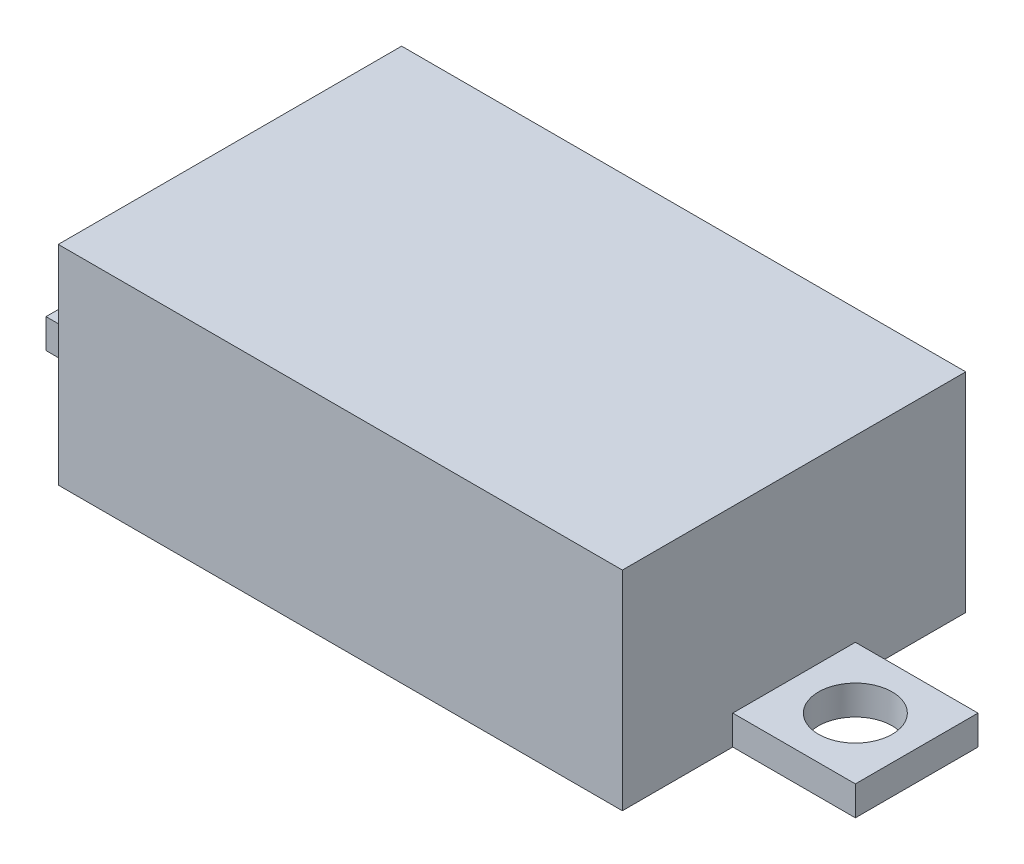
ISO-10303-21;
HEADER;
FILE_DESCRIPTION(('STEP AP214'),'2;1');
FILE_NAME('part.step','',(''),(''),'','','');
FILE_SCHEMA(('AUTOMOTIVE_DESIGN { 1 0 10303 214 1 1 1 1 }'));
ENDSEC;
DATA;
#1=APPLICATION_CONTEXT('core data for automotive mechanical design processes');
#2=APPLICATION_PROTOCOL_DEFINITION('international standard','automotive_design',2000,#1);
#3=PRODUCT_CONTEXT('',#1,'mechanical');
#4=PRODUCT('Part','Part','',(#3));
#5=PRODUCT_RELATED_PRODUCT_CATEGORY('part','',(#4));
#6=PRODUCT_DEFINITION_FORMATION('','',#4);
#7=PRODUCT_DEFINITION_CONTEXT('part definition',#1,'design');
#8=PRODUCT_DEFINITION('design','',#6,#7);
#9=PRODUCT_DEFINITION_SHAPE('','',#8);
#10=(LENGTH_UNIT() NAMED_UNIT(*) SI_UNIT(.MILLI.,.METRE.));
#11=(NAMED_UNIT(*) PLANE_ANGLE_UNIT() SI_UNIT($,.RADIAN.));
#12=(NAMED_UNIT(*) SI_UNIT($,.STERADIAN.) SOLID_ANGLE_UNIT());
#13=UNCERTAINTY_MEASURE_WITH_UNIT(LENGTH_MEASURE(1.E-05),#10,'distance_accuracy_value','');
#14=(GEOMETRIC_REPRESENTATION_CONTEXT(3) GLOBAL_UNCERTAINTY_ASSIGNED_CONTEXT((#13)) GLOBAL_UNIT_ASSIGNED_CONTEXT((#10,
#11,#12)) REPRESENTATION_CONTEXT('',''));
#15=CARTESIAN_POINT('',(0.,0.,0.));
#16=DIRECTION('',(0.,0.,1.));
#17=DIRECTION('',(1.,0.,0.));
#18=AXIS2_PLACEMENT_3D('',#15,#16,#17);
#19=CARTESIAN_POINT('',(0.,8.5,0.));
#20=DIRECTION('',(1.,0.,0.));
#21=DIRECTION('',(0.,0.,-1.));
#22=AXIS2_PLACEMENT_3D('',#19,#20,#21);
#23=PLANE('',#22);
#24=DIRECTION('',(0.,0.,-1.));
#25=VECTOR('',#24,1.);
#26=CARTESIAN_POINT('',(0.,1.2,0.));
#27=LINE('',#26,#25);
#28=CARTESIAN_POINT('',(0.,1.2,-4.5));
#29=VERTEX_POINT('',#28);
#30=CARTESIAN_POINT('',(0.,1.2,-9.5));
#31=VERTEX_POINT('',#30);
#32=EDGE_CURVE('E51',#29,#31,#27,.T.);
#33=ORIENTED_EDGE('',*,*,#32,.F.);
#34=DIRECTION('',(0.,-1.,0.));
#35=VECTOR('',#34,1.);
#36=CARTESIAN_POINT('',(0.,8.5,-4.5));
#37=LINE('',#36,#35);
#38=CARTESIAN_POINT('',(0.,0.,-4.5));
#39=VERTEX_POINT('',#38);
#40=EDGE_CURVE('E177',#29,#39,#37,.T.);
#41=ORIENTED_EDGE('',*,*,#40,.T.);
#42=DIRECTION('',(0.,0.,1.));
#43=VECTOR('',#42,1.);
#44=CARTESIAN_POINT('',(0.,0.,0.));
#45=LINE('',#44,#43);
#46=CARTESIAN_POINT('',(0.,0.,0.));
#47=VERTEX_POINT('',#46);
#48=EDGE_CURVE('E180',#39,#47,#45,.T.);
#49=ORIENTED_EDGE('',*,*,#48,.T.);
#50=DIRECTION('',(0.,-1.,0.));
#51=VECTOR('',#50,1.);
#52=CARTESIAN_POINT('',(0.,8.5,0.));
#53=LINE('',#52,#51);
#54=CARTESIAN_POINT('',(0.,8.5,0.));
#55=VERTEX_POINT('',#54);
#56=EDGE_CURVE('E40',#55,#47,#53,.T.);
#57=ORIENTED_EDGE('',*,*,#56,.F.);
#58=DIRECTION('',(0.,0.,1.));
#59=VECTOR('',#58,1.);
#60=CARTESIAN_POINT('',(0.,8.5,0.));
#61=LINE('',#60,#59);
#62=CARTESIAN_POINT('',(0.,8.5,-14.));
#63=VERTEX_POINT('',#62);
#64=EDGE_CURVE('E181',#63,#55,#61,.T.);
#65=ORIENTED_EDGE('',*,*,#64,.F.);
#66=DIRECTION('',(0.,-1.,0.));
#67=VECTOR('',#66,1.);
#68=CARTESIAN_POINT('',(0.,8.5,-14.));
#69=LINE('',#68,#67);
#70=CARTESIAN_POINT('',(0.,0.,-14.));
#71=VERTEX_POINT('',#70);
#72=EDGE_CURVE('E191',#63,#71,#69,.T.);
#73=ORIENTED_EDGE('',*,*,#72,.T.);
#74=CARTESIAN_POINT('',(0.,0.,-9.5));
#75=VERTEX_POINT('',#74);
#76=EDGE_CURVE('E192',#71,#75,#45,.T.);
#77=ORIENTED_EDGE('',*,*,#76,.T.);
#78=DIRECTION('',(0.,1.,0.));
#79=VECTOR('',#78,1.);
#80=CARTESIAN_POINT('',(0.,8.5,-9.5));
#81=LINE('',#80,#79);
#82=EDGE_CURVE('E47',#75,#31,#81,.T.);
#83=ORIENTED_EDGE('',*,*,#82,.T.);
#84=EDGE_LOOP('',(#33,#41,#49,#57,#65,#73,#77,#83));
#85=FACE_BOUND('',#84,.T.);
#86=ADVANCED_FACE('F33',(#85),#23,.F.);
#87=CARTESIAN_POINT('',(0.,8.5,0.));
#88=DIRECTION('',(0.,0.,-1.));
#89=DIRECTION('',(-1.,0.,0.));
#90=AXIS2_PLACEMENT_3D('',#87,#88,#89);
#91=PLANE('',#90);
#92=DIRECTION('',(1.,0.,0.));
#93=VECTOR('',#92,1.);
#94=CARTESIAN_POINT('',(0.,0.,0.));
#95=LINE('',#94,#93);
#96=CARTESIAN_POINT('',(23.,0.,0.));
#97=VERTEX_POINT('',#96);
#98=EDGE_CURVE('E194',#47,#97,#95,.T.);
#99=ORIENTED_EDGE('',*,*,#98,.T.);
#100=DIRECTION('',(0.,-1.,0.));
#101=VECTOR('',#100,1.);
#102=CARTESIAN_POINT('',(23.,8.5,0.));
#103=LINE('',#102,#101);
#104=CARTESIAN_POINT('',(23.,8.5,0.));
#105=VERTEX_POINT('',#104);
#106=EDGE_CURVE('E205',#105,#97,#103,.T.);
#107=ORIENTED_EDGE('',*,*,#106,.F.);
#108=DIRECTION('',(1.,0.,0.));
#109=VECTOR('',#108,1.);
#110=CARTESIAN_POINT('',(0.,8.5,0.));
#111=LINE('',#110,#109);
#112=EDGE_CURVE('E184',#55,#105,#111,.T.);
#113=ORIENTED_EDGE('',*,*,#112,.F.);
#114=ORIENTED_EDGE('',*,*,#56,.T.);
#115=EDGE_LOOP('',(#99,#107,#113,#114));
#116=FACE_BOUND('',#115,.T.);
#117=ADVANCED_FACE('F210',(#116),#91,.F.);
#118=CARTESIAN_POINT('',(23.,8.5,0.));
#119=DIRECTION('',(-1.,0.,0.));
#120=DIRECTION('',(0.,0.,1.));
#121=AXIS2_PLACEMENT_3D('',#118,#119,#120);
#122=PLANE('',#121);
#123=DIRECTION('',(0.,0.,-1.));
#124=VECTOR('',#123,1.);
#125=CARTESIAN_POINT('',(23.,0.,0.));
#126=LINE('',#125,#124);
#127=CARTESIAN_POINT('',(23.,0.,-4.5));
#128=VERTEX_POINT('',#127);
#129=EDGE_CURVE('E197',#97,#128,#126,.T.);
#130=ORIENTED_EDGE('',*,*,#129,.T.);
#131=DIRECTION('',(0.,1.,0.));
#132=VECTOR('',#131,1.);
#133=CARTESIAN_POINT('',(23.,8.5,-4.5));
#134=LINE('',#133,#132);
#135=CARTESIAN_POINT('',(23.,1.2,-4.5));
#136=VERTEX_POINT('',#135);
#137=EDGE_CURVE('E175',#128,#136,#134,.T.);
#138=ORIENTED_EDGE('',*,*,#137,.T.);
#139=DIRECTION('',(0.,0.,1.));
#140=VECTOR('',#139,1.);
#141=CARTESIAN_POINT('',(23.,1.2,0.));
#142=LINE('',#141,#140);
#143=CARTESIAN_POINT('',(23.,1.2,-9.5));
#144=VERTEX_POINT('',#143);
#145=EDGE_CURVE('E11',#144,#136,#142,.T.);
#146=ORIENTED_EDGE('',*,*,#145,.F.);
#147=DIRECTION('',(0.,-1.,0.));
#148=VECTOR('',#147,1.);
#149=CARTESIAN_POINT('',(23.,8.5,-9.5));
#150=LINE('',#149,#148);
#151=CARTESIAN_POINT('',(23.,0.,-9.5));
#152=VERTEX_POINT('',#151);
#153=EDGE_CURVE('E167',#144,#152,#150,.T.);
#154=ORIENTED_EDGE('',*,*,#153,.T.);
#155=CARTESIAN_POINT('',(23.,0.,-14.));
#156=VERTEX_POINT('',#155);
#157=EDGE_CURVE('E196',#152,#156,#126,.T.);
#158=ORIENTED_EDGE('',*,*,#157,.T.);
#159=DIRECTION('',(0.,-1.,0.));
#160=VECTOR('',#159,1.);
#161=CARTESIAN_POINT('',(23.,8.5,-14.));
#162=LINE('',#161,#160);
#163=CARTESIAN_POINT('',(23.,8.5,-14.));
#164=VERTEX_POINT('',#163);
#165=EDGE_CURVE('E202',#164,#156,#162,.T.);
#166=ORIENTED_EDGE('',*,*,#165,.F.);
#167=DIRECTION('',(0.,0.,-1.));
#168=VECTOR('',#167,1.);
#169=CARTESIAN_POINT('',(23.,8.5,0.));
#170=LINE('',#169,#168);
#171=EDGE_CURVE('E187',#105,#164,#170,.T.);
#172=ORIENTED_EDGE('',*,*,#171,.F.);
#173=ORIENTED_EDGE('',*,*,#106,.T.);
#174=EDGE_LOOP('',(#130,#138,#146,#154,#158,#166,#172,#173));
#175=FACE_BOUND('',#174,.T.);
#176=ADVANCED_FACE('F221',(#175),#122,.F.);
#177=CARTESIAN_POINT('',(0.,8.5,-14.));
#178=DIRECTION('',(0.,0.,1.));
#179=DIRECTION('',(1.,0.,0.));
#180=AXIS2_PLACEMENT_3D('',#177,#178,#179);
#181=PLANE('',#180);
#182=DIRECTION('',(-1.,0.,0.));
#183=VECTOR('',#182,1.);
#184=CARTESIAN_POINT('',(0.,0.,-14.));
#185=LINE('',#184,#183);
#186=EDGE_CURVE('E185',#156,#71,#185,.T.);
#187=ORIENTED_EDGE('',*,*,#186,.T.);
#188=ORIENTED_EDGE('',*,*,#72,.F.);
#189=DIRECTION('',(-1.,0.,0.));
#190=VECTOR('',#189,1.);
#191=CARTESIAN_POINT('',(0.,8.5,-14.));
#192=LINE('',#191,#190);
#193=EDGE_CURVE('E189',#164,#63,#192,.T.);
#194=ORIENTED_EDGE('',*,*,#193,.F.);
#195=ORIENTED_EDGE('',*,*,#165,.T.);
#196=EDGE_LOOP('',(#187,#188,#194,#195));
#197=FACE_BOUND('',#196,.T.);
#198=ADVANCED_FACE('F241',(#197),#181,.F.);
#199=CARTESIAN_POINT('',(0.,8.5,0.));
#200=DIRECTION('',(0.,-1.,0.));
#201=DIRECTION('',(0.,0.,-1.));
#202=AXIS2_PLACEMENT_3D('',#199,#200,#201);
#203=PLANE('',#202);
#204=ORIENTED_EDGE('',*,*,#64,.T.);
#205=ORIENTED_EDGE('',*,*,#112,.T.);
#206=ORIENTED_EDGE('',*,*,#171,.T.);
#207=ORIENTED_EDGE('',*,*,#193,.T.);
#208=EDGE_LOOP('',(#204,#205,#206,#207));
#209=FACE_BOUND('',#208,.T.);
#210=ADVANCED_FACE('F244',(#209),#203,.F.);
#211=CARTESIAN_POINT('',(0.,0.,0.));
#212=DIRECTION('',(0.,-1.,0.));
#213=DIRECTION('',(0.,0.,-1.));
#214=AXIS2_PLACEMENT_3D('',#211,#212,#213);
#215=PLANE('',#214);
#216=CARTESIAN_POINT('',(-2.5,0.,-7.));
#217=DIRECTION('',(0.,-1.,0.));
#218=DIRECTION('',(0.,0.,-1.));
#219=AXIS2_PLACEMENT_3D('',#216,#217,#218);
#220=CIRCLE('',#219,1.5);
#221=CARTESIAN_POINT('',(-2.5,0.,-8.5));
#222=VERTEX_POINT('',#221);
#223=EDGE_CURVE('E385',#222,#222,#220,.T.);
#224=ORIENTED_EDGE('',*,*,#223,.F.);
#225=EDGE_LOOP('',(#224));
#226=FACE_BOUND('',#225,.T.);
#227=CARTESIAN_POINT('',(25.5,0.,-7.));
#228=DIRECTION('',(0.,-1.,0.));
#229=DIRECTION('',(0.,0.,-1.));
#230=AXIS2_PLACEMENT_3D('',#227,#228,#229);
#231=CIRCLE('',#230,1.5);
#232=CARTESIAN_POINT('',(25.5,0.,-8.5));
#233=VERTEX_POINT('',#232);
#234=EDGE_CURVE('E151',#233,#233,#231,.T.);
#235=ORIENTED_EDGE('',*,*,#234,.F.);
#236=EDGE_LOOP('',(#235));
#237=FACE_BOUND('',#236,.T.);
#238=ORIENTED_EDGE('',*,*,#157,.F.);
#239=DIRECTION('',(1.,0.,0.));
#240=VECTOR('',#239,1.);
#241=CARTESIAN_POINT('',(-5.,0.,-9.5));
#242=LINE('',#241,#240);
#243=CARTESIAN_POINT('',(28.,0.,-9.5));
#244=VERTEX_POINT('',#243);
#245=EDGE_CURVE('E161',#152,#244,#242,.T.);
#246=ORIENTED_EDGE('',*,*,#245,.T.);
#247=DIRECTION('',(0.,0.,1.));
#248=VECTOR('',#247,1.);
#249=CARTESIAN_POINT('',(28.,0.,-4.5));
#250=LINE('',#249,#248);
#251=CARTESIAN_POINT('',(28.,0.,-4.5));
#252=VERTEX_POINT('',#251);
#253=EDGE_CURVE('E163',#244,#252,#250,.T.);
#254=ORIENTED_EDGE('',*,*,#253,.T.);
#255=DIRECTION('',(-1.,0.,0.));
#256=VECTOR('',#255,1.);
#257=CARTESIAN_POINT('',(-5.,0.,-4.5));
#258=LINE('',#257,#256);
#259=EDGE_CURVE('E145',#252,#128,#258,.T.);
#260=ORIENTED_EDGE('',*,*,#259,.T.);
#261=ORIENTED_EDGE('',*,*,#129,.F.);
#262=ORIENTED_EDGE('',*,*,#98,.F.);
#263=ORIENTED_EDGE('',*,*,#48,.F.);
#264=CARTESIAN_POINT('',(-5.,0.,-4.5));
#265=VERTEX_POINT('',#264);
#266=EDGE_CURVE('E148',#39,#265,#258,.T.);
#267=ORIENTED_EDGE('',*,*,#266,.T.);
#268=DIRECTION('',(0.,0.,-1.));
#269=VECTOR('',#268,1.);
#270=CARTESIAN_POINT('',(-5.,0.,-4.5));
#271=LINE('',#270,#269);
#272=CARTESIAN_POINT('',(-5.,0.,-9.5));
#273=VERTEX_POINT('',#272);
#274=EDGE_CURVE('E159',#265,#273,#271,.T.);
#275=ORIENTED_EDGE('',*,*,#274,.T.);
#276=EDGE_CURVE('E125',#273,#75,#242,.T.);
#277=ORIENTED_EDGE('',*,*,#276,.T.);
#278=ORIENTED_EDGE('',*,*,#76,.F.);
#279=ORIENTED_EDGE('',*,*,#186,.F.);
#280=EDGE_LOOP('',(#238,#246,#254,#260,#261,#262,#263,#267,#275,#277,#278,#279));
#281=FACE_BOUND('',#280,.T.);
#282=ADVANCED_FACE('F217',(#226,#237,#281),#215,.T.);
#283=CARTESIAN_POINT('',(28.,1.2,-4.5));
#284=DIRECTION('',(1.,0.,0.));
#285=DIRECTION('',(0.,0.,-1.));
#286=AXIS2_PLACEMENT_3D('',#283,#284,#285);
#287=PLANE('',#286);
#288=ORIENTED_EDGE('',*,*,#253,.F.);
#289=DIRECTION('',(0.,-1.,0.));
#290=VECTOR('',#289,1.);
#291=CARTESIAN_POINT('',(28.,1.2,-9.5));
#292=LINE('',#291,#290);
#293=CARTESIAN_POINT('',(28.,1.2,-9.5));
#294=VERTEX_POINT('',#293);
#295=EDGE_CURVE('E130',#294,#244,#292,.T.);
#296=ORIENTED_EDGE('',*,*,#295,.F.);
#297=DIRECTION('',(0.,0.,1.));
#298=VECTOR('',#297,1.);
#299=CARTESIAN_POINT('',(28.,1.2,-4.5));
#300=LINE('',#299,#298);
#301=CARTESIAN_POINT('',(28.,1.2,-4.5));
#302=VERTEX_POINT('',#301);
#303=EDGE_CURVE('E138',#294,#302,#300,.T.);
#304=ORIENTED_EDGE('',*,*,#303,.T.);
#305=DIRECTION('',(0.,-1.,0.));
#306=VECTOR('',#305,1.);
#307=CARTESIAN_POINT('',(28.,1.2,-4.5));
#308=LINE('',#307,#306);
#309=EDGE_CURVE('E168',#302,#252,#308,.T.);
#310=ORIENTED_EDGE('',*,*,#309,.T.);
#311=EDGE_LOOP('',(#288,#296,#304,#310));
#312=FACE_BOUND('',#311,.T.);
#313=ADVANCED_FACE('F252',(#312),#287,.T.);
#314=CARTESIAN_POINT('',(0.,1.2,0.));
#315=DIRECTION('',(0.,-1.,0.));
#316=DIRECTION('',(0.,0.,-1.));
#317=AXIS2_PLACEMENT_3D('',#314,#315,#316);
#318=PLANE('',#317);
#319=CARTESIAN_POINT('',(25.5,1.2,-7.));
#320=DIRECTION('',(0.,1.,0.));
#321=DIRECTION('',(0.,0.,1.));
#322=AXIS2_PLACEMENT_3D('',#319,#320,#321);
#323=CIRCLE('',#322,1.5);
#324=CARTESIAN_POINT('',(25.5,1.2,-5.5));
#325=VERTEX_POINT('',#324);
#326=EDGE_CURVE('E381',#325,#325,#323,.T.);
#327=ORIENTED_EDGE('',*,*,#326,.F.);
#328=EDGE_LOOP('',(#327));
#329=FACE_BOUND('',#328,.T.);
#330=DIRECTION('',(1.,0.,0.));
#331=VECTOR('',#330,1.);
#332=CARTESIAN_POINT('',(-5.,1.2,-9.5));
#333=LINE('',#332,#331);
#334=EDGE_CURVE('E139',#144,#294,#333,.T.);
#335=ORIENTED_EDGE('',*,*,#334,.F.);
#336=ORIENTED_EDGE('',*,*,#145,.T.);
#337=DIRECTION('',(-1.,0.,0.));
#338=VECTOR('',#337,1.);
#339=CARTESIAN_POINT('',(-5.,1.2,-4.5));
#340=LINE('',#339,#338);
#341=EDGE_CURVE('E131',#302,#136,#340,.T.);
#342=ORIENTED_EDGE('',*,*,#341,.F.);
#343=ORIENTED_EDGE('',*,*,#303,.F.);
#344=EDGE_LOOP('',(#335,#336,#342,#343));
#345=FACE_BOUND('',#344,.T.);
#346=ADVANCED_FACE('F229',(#329,#345),#318,.F.);
#347=CARTESIAN_POINT('',(-5.,1.2,-9.5));
#348=DIRECTION('',(0.,0.,-1.));
#349=DIRECTION('',(-1.,0.,0.));
#350=AXIS2_PLACEMENT_3D('',#347,#348,#349);
#351=PLANE('',#350);
#352=ORIENTED_EDGE('',*,*,#153,.F.);
#353=ORIENTED_EDGE('',*,*,#334,.T.);
#354=ORIENTED_EDGE('',*,*,#295,.T.);
#355=ORIENTED_EDGE('',*,*,#245,.F.);
#356=EDGE_LOOP('',(#352,#353,#354,#355));
#357=FACE_BOUND('',#356,.T.);
#358=ADVANCED_FACE('F233',(#357),#351,.T.);
#359=CARTESIAN_POINT('',(-5.,1.2,-4.5));
#360=DIRECTION('',(0.,0.,1.));
#361=DIRECTION('',(1.,0.,0.));
#362=AXIS2_PLACEMENT_3D('',#359,#360,#361);
#363=PLANE('',#362);
#364=ORIENTED_EDGE('',*,*,#137,.F.);
#365=ORIENTED_EDGE('',*,*,#259,.F.);
#366=ORIENTED_EDGE('',*,*,#309,.F.);
#367=ORIENTED_EDGE('',*,*,#341,.T.);
#368=EDGE_LOOP('',(#364,#365,#366,#367));
#369=FACE_BOUND('',#368,.T.);
#370=ADVANCED_FACE('F224',(#369),#363,.T.);
#371=CARTESIAN_POINT('',(-2.5,1.2,-7.));
#372=DIRECTION('',(0.,1.,0.));
#373=DIRECTION('',(0.,0.,1.));
#374=AXIS2_PLACEMENT_3D('',#371,#372,#373);
#375=CIRCLE('',#374,1.5);
#376=CARTESIAN_POINT('',(-2.5,1.2,-5.5));
#377=VERTEX_POINT('',#376);
#378=EDGE_CURVE('E382',#377,#377,#375,.T.);
#379=ORIENTED_EDGE('',*,*,#378,.F.);
#380=EDGE_LOOP('',(#379));
#381=FACE_BOUND('',#380,.T.);
#382=CARTESIAN_POINT('',(-5.,1.2,-4.5));
#383=VERTEX_POINT('',#382);
#384=EDGE_CURVE('E156',#29,#383,#340,.T.);
#385=ORIENTED_EDGE('',*,*,#384,.F.);
#386=ORIENTED_EDGE('',*,*,#32,.T.);
#387=CARTESIAN_POINT('',(-5.,1.2,-9.5));
#388=VERTEX_POINT('',#387);
#389=EDGE_CURVE('E123',#388,#31,#333,.T.);
#390=ORIENTED_EDGE('',*,*,#389,.F.);
#391=DIRECTION('',(0.,0.,-1.));
#392=VECTOR('',#391,1.);
#393=CARTESIAN_POINT('',(-5.,1.2,-4.5));
#394=LINE('',#393,#392);
#395=EDGE_CURVE('E137',#383,#388,#394,.T.);
#396=ORIENTED_EDGE('',*,*,#395,.F.);
#397=EDGE_LOOP('',(#385,#386,#390,#396));
#398=FACE_BOUND('',#397,.T.);
#399=ADVANCED_FACE('F136',(#381,#398),#318,.F.);
#400=ORIENTED_EDGE('',*,*,#40,.F.);
#401=ORIENTED_EDGE('',*,*,#384,.T.);
#402=DIRECTION('',(0.,-1.,0.));
#403=VECTOR('',#402,1.);
#404=CARTESIAN_POINT('',(-5.,1.2,-4.5));
#405=LINE('',#404,#403);
#406=EDGE_CURVE('E144',#383,#265,#405,.T.);
#407=ORIENTED_EDGE('',*,*,#406,.T.);
#408=ORIENTED_EDGE('',*,*,#266,.F.);
#409=EDGE_LOOP('',(#400,#401,#407,#408));
#410=FACE_BOUND('',#409,.T.);
#411=ADVANCED_FACE('F326',(#410),#363,.T.);
#412=ORIENTED_EDGE('',*,*,#82,.F.);
#413=ORIENTED_EDGE('',*,*,#276,.F.);
#414=DIRECTION('',(0.,-1.,0.));
#415=VECTOR('',#414,1.);
#416=CARTESIAN_POINT('',(-5.,1.2,-9.5));
#417=LINE('',#416,#415);
#418=EDGE_CURVE('E120',#388,#273,#417,.T.);
#419=ORIENTED_EDGE('',*,*,#418,.F.);
#420=ORIENTED_EDGE('',*,*,#389,.T.);
#421=EDGE_LOOP('',(#412,#413,#419,#420));
#422=FACE_BOUND('',#421,.T.);
#423=ADVANCED_FACE('F122',(#422),#351,.T.);
#424=CARTESIAN_POINT('',(-5.,1.2,-4.5));
#425=DIRECTION('',(-1.,0.,0.));
#426=DIRECTION('',(0.,0.,1.));
#427=AXIS2_PLACEMENT_3D('',#424,#425,#426);
#428=PLANE('',#427);
#429=ORIENTED_EDGE('',*,*,#274,.F.);
#430=ORIENTED_EDGE('',*,*,#406,.F.);
#431=ORIENTED_EDGE('',*,*,#395,.T.);
#432=ORIENTED_EDGE('',*,*,#418,.T.);
#433=EDGE_LOOP('',(#429,#430,#431,#432));
#434=FACE_BOUND('',#433,.T.);
#435=ADVANCED_FACE('F142',(#434),#428,.T.);
#436=CARTESIAN_POINT('',(-2.5,-8.8,-7.));
#437=DIRECTION('',(0.,1.,0.));
#438=DIRECTION('',(0.,0.,1.));
#439=AXIS2_PLACEMENT_3D('',#436,#437,#438);
#440=CYLINDRICAL_SURFACE('',#439,1.5);
#441=ORIENTED_EDGE('',*,*,#223,.T.);
#442=EDGE_LOOP('',(#441));
#443=FACE_BOUND('',#442,.T.);
#444=ORIENTED_EDGE('',*,*,#378,.T.);
#445=EDGE_LOOP('',(#444));
#446=FACE_BOUND('',#445,.T.);
#447=ADVANCED_FACE('F353',(#443,#446),#440,.F.);
#448=CARTESIAN_POINT('',(25.5,-8.8,-7.));
#449=DIRECTION('',(0.,1.,0.));
#450=DIRECTION('',(0.,0.,1.));
#451=AXIS2_PLACEMENT_3D('',#448,#449,#450);
#452=CYLINDRICAL_SURFACE('',#451,1.5);
#453=ORIENTED_EDGE('',*,*,#234,.T.);
#454=EDGE_LOOP('',(#453));
#455=FACE_BOUND('',#454,.T.);
#456=ORIENTED_EDGE('',*,*,#326,.T.);
#457=EDGE_LOOP('',(#456));
#458=FACE_BOUND('',#457,.T.);
#459=ADVANCED_FACE('F360',(#455,#458),#452,.F.);
#460=CLOSED_SHELL('',(#86,#117,#176,#198,#210,#282,#313,#346,#358,#370,#399,#411,#423,#435,#447,#459));
#461=MANIFOLD_SOLID_BREP('B2',#460);
#462=ADVANCED_BREP_SHAPE_REPRESENTATION('',(#18,#461),#14);
#463=SHAPE_DEFINITION_REPRESENTATION(#9,#462);
ENDSEC;
END-ISO-10303-21;
